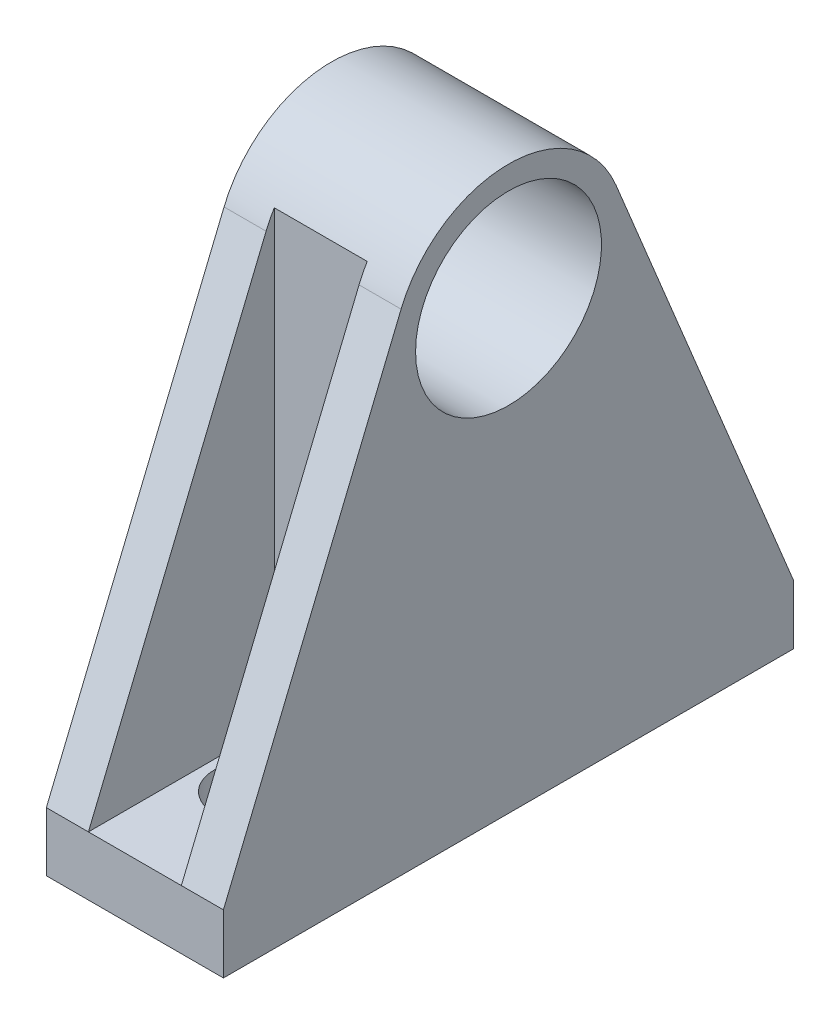
ISO-10303-21;
HEADER;
FILE_DESCRIPTION(('STEP AP214'),'2;1');
FILE_NAME('part.step','',(''),(''),'','','');
FILE_SCHEMA(('AUTOMOTIVE_DESIGN { 1 0 10303 214 1 1 1 1 }'));
ENDSEC;
DATA;
#1=APPLICATION_CONTEXT('core data for automotive mechanical design processes');
#2=APPLICATION_PROTOCOL_DEFINITION('international standard','automotive_design',2000,#1);
#3=PRODUCT_CONTEXT('',#1,'mechanical');
#4=PRODUCT('Part','Part','',(#3));
#5=PRODUCT_RELATED_PRODUCT_CATEGORY('part','',(#4));
#6=PRODUCT_DEFINITION_FORMATION('','',#4);
#7=PRODUCT_DEFINITION_CONTEXT('part definition',#1,'design');
#8=PRODUCT_DEFINITION('design','',#6,#7);
#9=PRODUCT_DEFINITION_SHAPE('','',#8);
#10=(LENGTH_UNIT() NAMED_UNIT(*) SI_UNIT(.MILLI.,.METRE.));
#11=(NAMED_UNIT(*) PLANE_ANGLE_UNIT() SI_UNIT($,.RADIAN.));
#12=(NAMED_UNIT(*) SI_UNIT($,.STERADIAN.) SOLID_ANGLE_UNIT());
#13=UNCERTAINTY_MEASURE_WITH_UNIT(LENGTH_MEASURE(1.E-05),#10,'distance_accuracy_value','');
#14=(GEOMETRIC_REPRESENTATION_CONTEXT(3) GLOBAL_UNCERTAINTY_ASSIGNED_CONTEXT((#13)) GLOBAL_UNIT_ASSIGNED_CONTEXT((#10,
#11,#12)) REPRESENTATION_CONTEXT('',''));
#15=CARTESIAN_POINT('',(0.,0.,0.));
#16=DIRECTION('',(0.,0.,1.));
#17=DIRECTION('',(1.,0.,0.));
#18=AXIS2_PLACEMENT_3D('',#15,#16,#17);
#19=CARTESIAN_POINT('',(19.05,6.35,-30.675));
#20=DIRECTION('',(0.,-0.380865334381038,0.924630519216633));
#21=DIRECTION('',(0.,-0.924630519216633,-0.380865334381038));
#22=AXIS2_PLACEMENT_3D('',#19,#20,#21);
#23=PLANE('',#22);
#24=DIRECTION('',(0.,0.924630519216633,0.380865334381038));
#25=VECTOR('',#24,1.);
#26=CARTESIAN_POINT('',(4.525,54.9041967592978,-10.675));
#27=LINE('',#26,#25);
#28=CARTESIAN_POINT('',(4.525,6.35000000000003,-30.675));
#29=VERTEX_POINT('',#28);
#30=CARTESIAN_POINT('',(4.525,52.760816679763,-11.5578814902079));
#31=VERTEX_POINT('',#30);
#32=EDGE_CURVE('E188',#29,#31,#27,.T.);
#33=ORIENTED_EDGE('',*,*,#32,.F.);
#34=DIRECTION('',(-1.,0.,0.));
#35=VECTOR('',#34,1.);
#36=CARTESIAN_POINT('',(19.05,6.35,-30.675));
#37=LINE('',#36,#35);
#38=CARTESIAN_POINT('',(0.,6.35,-30.675));
#39=VERTEX_POINT('',#38);
#40=EDGE_CURVE('E295',#29,#39,#37,.T.);
#41=ORIENTED_EDGE('',*,*,#40,.T.);
#42=DIRECTION('',(0.,0.924630519216633,0.380865334381038));
#43=VECTOR('',#42,1.);
#44=CARTESIAN_POINT('',(0.,6.35,-30.675));
#45=LINE('',#44,#43);
#46=CARTESIAN_POINT('',(0.,52.760816679763,-11.5578814902079));
#47=VERTEX_POINT('',#46);
#48=EDGE_CURVE('E263',#39,#47,#45,.T.);
#49=ORIENTED_EDGE('',*,*,#48,.T.);
#50=DIRECTION('',(-1.,0.,0.));
#51=VECTOR('',#50,1.);
#52=CARTESIAN_POINT('',(19.05,52.760816679763,-11.5578814902079));
#53=LINE('',#52,#51);
#54=EDGE_CURVE('E290',#31,#47,#53,.T.);
#55=ORIENTED_EDGE('',*,*,#54,.F.);
#56=EDGE_LOOP('',(#33,#41,#49,#55));
#57=FACE_BOUND('',#56,.T.);
#58=ADVANCED_FACE('F45',(#57),#23,.F.);
#59=CARTESIAN_POINT('',(19.05,48.,0.));
#60=DIRECTION('',(-1.,0.,0.));
#61=DIRECTION('',(0.,0.,1.));
#62=AXIS2_PLACEMENT_3D('',#59,#60,#61);
#63=CYLINDRICAL_SURFACE('',#62,12.5);
#64=DIRECTION('',(-1.,0.,0.));
#65=VECTOR('',#64,1.);
#66=CARTESIAN_POINT('',(19.05,52.760816679763,11.5578814902079));
#67=LINE('',#66,#65);
#68=CARTESIAN_POINT('',(4.525,52.760816679763,11.5578814902079));
#69=VERTEX_POINT('',#68);
#70=CARTESIAN_POINT('',(0.,52.760816679763,11.5578814902079));
#71=VERTEX_POINT('',#70);
#72=EDGE_CURVE('E285',#69,#71,#67,.T.);
#73=ORIENTED_EDGE('',*,*,#72,.F.);
#74=CARTESIAN_POINT('',(4.525,48.,0.));
#75=DIRECTION('',(-1.,0.,0.));
#76=DIRECTION('',(0.,0.,1.));
#77=AXIS2_PLACEMENT_3D('',#74,#75,#76);
#78=CIRCLE('',#77,12.5);
#79=CARTESIAN_POINT('',(4.525,54.5034125657227,10.675));
#80=VERTEX_POINT('',#79);
#81=EDGE_CURVE('E214',#69,#80,#78,.T.);
#82=ORIENTED_EDGE('',*,*,#81,.T.);
#83=DIRECTION('',(-1.,0.,0.));
#84=VECTOR('',#83,1.);
#85=CARTESIAN_POINT('',(19.05,54.5034125657227,10.675));
#86=LINE('',#85,#84);
#87=CARTESIAN_POINT('',(14.525,54.5034125657227,10.675));
#88=VERTEX_POINT('',#87);
#89=EDGE_CURVE('E11',#80,#88,#86,.F.);
#90=ORIENTED_EDGE('',*,*,#89,.T.);
#91=CARTESIAN_POINT('',(14.525,48.,0.));
#92=DIRECTION('',(-1.,0.,0.));
#93=DIRECTION('',(0.,0.,1.));
#94=AXIS2_PLACEMENT_3D('',#91,#92,#93);
#95=CIRCLE('',#94,12.5);
#96=CARTESIAN_POINT('',(14.525,52.760816679763,11.5578814902079));
#97=VERTEX_POINT('',#96);
#98=EDGE_CURVE('E211',#97,#88,#95,.T.);
#99=ORIENTED_EDGE('',*,*,#98,.F.);
#100=CARTESIAN_POINT('',(19.05,52.760816679763,11.5578814902079));
#101=VERTEX_POINT('',#100);
#102=EDGE_CURVE('E286',#101,#97,#67,.T.);
#103=ORIENTED_EDGE('',*,*,#102,.F.);
#104=CARTESIAN_POINT('',(19.05,48.,0.));
#105=DIRECTION('',(1.,0.,0.));
#106=DIRECTION('',(0.,0.,-1.));
#107=AXIS2_PLACEMENT_3D('',#104,#105,#106);
#108=CIRCLE('',#107,12.5);
#109=CARTESIAN_POINT('',(19.05,52.760816679763,-11.5578814902079));
#110=VERTEX_POINT('',#109);
#111=EDGE_CURVE('E246',#110,#101,#108,.T.);
#112=ORIENTED_EDGE('',*,*,#111,.F.);
#113=CARTESIAN_POINT('',(14.525,52.760816679763,-11.5578814902079));
#114=VERTEX_POINT('',#113);
#115=EDGE_CURVE('E291',#110,#114,#53,.T.);
#116=ORIENTED_EDGE('',*,*,#115,.T.);
#117=CARTESIAN_POINT('',(14.525,48.,0.));
#118=DIRECTION('',(1.,0.,0.));
#119=DIRECTION('',(0.,0.,-1.));
#120=AXIS2_PLACEMENT_3D('',#117,#118,#119);
#121=CIRCLE('',#120,12.5);
#122=CARTESIAN_POINT('',(14.525,54.5034125657227,-10.675));
#123=VERTEX_POINT('',#122);
#124=EDGE_CURVE('E304',#114,#123,#121,.T.);
#125=ORIENTED_EDGE('',*,*,#124,.T.);
#126=DIRECTION('',(-1.,0.,0.));
#127=VECTOR('',#126,1.);
#128=CARTESIAN_POINT('',(19.05,54.5034125657227,-10.675));
#129=LINE('',#128,#127);
#130=CARTESIAN_POINT('',(4.525,54.5034125657227,-10.675));
#131=VERTEX_POINT('',#130);
#132=EDGE_CURVE('E314',#123,#131,#129,.T.);
#133=ORIENTED_EDGE('',*,*,#132,.T.);
#134=CARTESIAN_POINT('',(4.525,48.,0.));
#135=DIRECTION('',(1.,0.,0.));
#136=DIRECTION('',(0.,0.,-1.));
#137=AXIS2_PLACEMENT_3D('',#134,#135,#136);
#138=CIRCLE('',#137,12.5);
#139=EDGE_CURVE('E54',#31,#131,#138,.T.);
#140=ORIENTED_EDGE('',*,*,#139,.F.);
#141=ORIENTED_EDGE('',*,*,#54,.T.);
#142=CARTESIAN_POINT('',(0.,48.,0.));
#143=DIRECTION('',(1.,0.,0.));
#144=DIRECTION('',(0.,0.,-1.));
#145=AXIS2_PLACEMENT_3D('',#142,#143,#144);
#146=CIRCLE('',#145,12.5);
#147=EDGE_CURVE('E267',#47,#71,#146,.T.);
#148=ORIENTED_EDGE('',*,*,#147,.T.);
#149=EDGE_LOOP('',(#73,#82,#90,#99,#103,#112,#116,#125,#133,#140,#141,#148));
#150=FACE_BOUND('',#149,.T.);
#151=ADVANCED_FACE('F330',(#150),#63,.T.);
#152=CARTESIAN_POINT('',(19.05,6.35,30.675));
#153=DIRECTION('',(0.,-0.380865334381038,-0.924630519216633));
#154=DIRECTION('',(0.,0.924630519216633,-0.380865334381038));
#155=AXIS2_PLACEMENT_3D('',#152,#153,#154);
#156=PLANE('',#155);
#157=DIRECTION('',(0.,-0.924630519216633,0.380865334381038));
#158=VECTOR('',#157,1.);
#159=CARTESIAN_POINT('',(14.525,54.9041967592978,10.675));
#160=LINE('',#159,#158);
#161=CARTESIAN_POINT('',(14.525,6.35,30.675));
#162=VERTEX_POINT('',#161);
#163=EDGE_CURVE('E175',#97,#162,#160,.T.);
#164=ORIENTED_EDGE('',*,*,#163,.T.);
#165=DIRECTION('',(-1.,0.,0.));
#166=VECTOR('',#165,1.);
#167=CARTESIAN_POINT('',(19.05,6.35,30.675));
#168=LINE('',#167,#166);
#169=CARTESIAN_POINT('',(19.05,6.35,30.675));
#170=VERTEX_POINT('',#169);
#171=EDGE_CURVE('E281',#170,#162,#168,.T.);
#172=ORIENTED_EDGE('',*,*,#171,.F.);
#173=DIRECTION('',(0.,-0.924630519216633,0.380865334381038));
#174=VECTOR('',#173,1.);
#175=CARTESIAN_POINT('',(19.05,6.35,30.675));
#176=LINE('',#175,#174);
#177=EDGE_CURVE('E249',#101,#170,#176,.T.);
#178=ORIENTED_EDGE('',*,*,#177,.F.);
#179=ORIENTED_EDGE('',*,*,#102,.T.);
#180=EDGE_LOOP('',(#164,#172,#178,#179));
#181=FACE_BOUND('',#180,.T.);
#182=ADVANCED_FACE('F375',(#181),#156,.F.);
#183=CARTESIAN_POINT('',(19.05,48.,0.));
#184=DIRECTION('',(1.,0.,0.));
#185=DIRECTION('',(0.,0.,-1.));
#186=AXIS2_PLACEMENT_3D('',#183,#184,#185);
#187=PLANE('',#186);
#188=DIRECTION('',(0.,0.,-1.));
#189=VECTOR('',#188,1.);
#190=CARTESIAN_POINT('',(19.05,0.,30.675));
#191=LINE('',#190,#189);
#192=CARTESIAN_POINT('',(19.05,0.,30.675));
#193=VERTEX_POINT('',#192);
#194=CARTESIAN_POINT('',(19.05,0.,-30.675));
#195=VERTEX_POINT('',#194);
#196=EDGE_CURVE('E235',#193,#195,#191,.T.);
#197=ORIENTED_EDGE('',*,*,#196,.T.);
#198=DIRECTION('',(0.,1.,0.));
#199=VECTOR('',#198,1.);
#200=CARTESIAN_POINT('',(19.05,0.,-30.675));
#201=LINE('',#200,#199);
#202=CARTESIAN_POINT('',(19.05,6.35,-30.675));
#203=VERTEX_POINT('',#202);
#204=EDGE_CURVE('E239',#195,#203,#201,.T.);
#205=ORIENTED_EDGE('',*,*,#204,.T.);
#206=DIRECTION('',(0.,0.924630519216633,0.380865334381038));
#207=VECTOR('',#206,1.);
#208=CARTESIAN_POINT('',(19.05,6.35,-30.675));
#209=LINE('',#208,#207);
#210=EDGE_CURVE('E243',#203,#110,#209,.T.);
#211=ORIENTED_EDGE('',*,*,#210,.T.);
#212=ORIENTED_EDGE('',*,*,#111,.T.);
#213=ORIENTED_EDGE('',*,*,#177,.T.);
#214=DIRECTION('',(0.,-1.,0.));
#215=VECTOR('',#214,1.);
#216=CARTESIAN_POINT('',(19.05,0.,30.675));
#217=LINE('',#216,#215);
#218=EDGE_CURVE('E252',#170,#193,#217,.T.);
#219=ORIENTED_EDGE('',*,*,#218,.T.);
#220=EDGE_LOOP('',(#197,#205,#211,#212,#213,#219));
#221=FACE_BOUND('',#220,.T.);
#222=CARTESIAN_POINT('',(19.05,48.,0.));
#223=DIRECTION('',(1.,0.,0.));
#224=DIRECTION('',(0.,0.,-1.));
#225=AXIS2_PLACEMENT_3D('',#222,#223,#224);
#226=CIRCLE('',#225,10.);
#227=CARTESIAN_POINT('',(19.05,48.,10.));
#228=VERTEX_POINT('',#227);
#229=EDGE_CURVE('E227',#228,#228,#226,.T.);
#230=ORIENTED_EDGE('',*,*,#229,.F.);
#231=EDGE_LOOP('',(#230));
#232=FACE_BOUND('',#231,.T.);
#233=ADVANCED_FACE('F370',(#221,#232),#187,.T.);
#234=CARTESIAN_POINT('',(0.,48.,0.));
#235=DIRECTION('',(1.,0.,0.));
#236=DIRECTION('',(0.,0.,-1.));
#237=AXIS2_PLACEMENT_3D('',#234,#235,#236);
#238=PLANE('',#237);
#239=DIRECTION('',(0.,0.,-1.));
#240=VECTOR('',#239,1.);
#241=CARTESIAN_POINT('',(0.,0.,30.675));
#242=LINE('',#241,#240);
#243=CARTESIAN_POINT('',(0.,0.,30.675));
#244=VERTEX_POINT('',#243);
#245=CARTESIAN_POINT('',(0.,0.,-30.675));
#246=VERTEX_POINT('',#245);
#247=EDGE_CURVE('E231',#244,#246,#242,.T.);
#248=ORIENTED_EDGE('',*,*,#247,.F.);
#249=DIRECTION('',(0.,-1.,0.));
#250=VECTOR('',#249,1.);
#251=CARTESIAN_POINT('',(0.,0.,30.675));
#252=LINE('',#251,#250);
#253=CARTESIAN_POINT('',(0.,6.35,30.675));
#254=VERTEX_POINT('',#253);
#255=EDGE_CURVE('E240',#254,#244,#252,.T.);
#256=ORIENTED_EDGE('',*,*,#255,.F.);
#257=DIRECTION('',(0.,-0.924630519216633,0.380865334381038));
#258=VECTOR('',#257,1.);
#259=CARTESIAN_POINT('',(0.,6.35,30.675));
#260=LINE('',#259,#258);
#261=EDGE_CURVE('E271',#71,#254,#260,.T.);
#262=ORIENTED_EDGE('',*,*,#261,.F.);
#263=ORIENTED_EDGE('',*,*,#147,.F.);
#264=ORIENTED_EDGE('',*,*,#48,.F.);
#265=DIRECTION('',(0.,1.,0.));
#266=VECTOR('',#265,1.);
#267=CARTESIAN_POINT('',(0.,0.,-30.675));
#268=LINE('',#267,#266);
#269=EDGE_CURVE('E259',#246,#39,#268,.T.);
#270=ORIENTED_EDGE('',*,*,#269,.F.);
#271=EDGE_LOOP('',(#248,#256,#262,#263,#264,#270));
#272=FACE_BOUND('',#271,.T.);
#273=CARTESIAN_POINT('',(0.,48.,0.));
#274=DIRECTION('',(1.,0.,0.));
#275=DIRECTION('',(0.,0.,-1.));
#276=AXIS2_PLACEMENT_3D('',#273,#274,#275);
#277=CIRCLE('',#276,10.);
#278=CARTESIAN_POINT('',(0.,48.,10.));
#279=VERTEX_POINT('',#278);
#280=EDGE_CURVE('E226',#279,#279,#277,.T.);
#281=ORIENTED_EDGE('',*,*,#280,.T.);
#282=EDGE_LOOP('',(#281));
#283=FACE_BOUND('',#282,.T.);
#284=ADVANCED_FACE('F362',(#272,#283),#238,.F.);
#285=CARTESIAN_POINT('',(19.05,0.,30.675));
#286=DIRECTION('',(0.,1.,0.));
#287=DIRECTION('',(0.,0.,1.));
#288=AXIS2_PLACEMENT_3D('',#285,#286,#287);
#289=PLANE('',#288);
#290=CARTESIAN_POINT('',(9.525,0.,18.175));
#291=DIRECTION('',(0.,1.,0.));
#292=DIRECTION('',(0.,0.,1.));
#293=AXIS2_PLACEMENT_3D('',#290,#291,#292);
#294=CIRCLE('',#293,4.);
#295=CARTESIAN_POINT('',(9.525,0.,22.175));
#296=VERTEX_POINT('',#295);
#297=EDGE_CURVE('E218',#296,#296,#294,.T.);
#298=ORIENTED_EDGE('',*,*,#297,.T.);
#299=EDGE_LOOP('',(#298));
#300=FACE_BOUND('',#299,.T.);
#301=CARTESIAN_POINT('',(9.525,0.,-18.175));
#302=DIRECTION('',(0.,1.,0.));
#303=DIRECTION('',(0.,0.,1.));
#304=AXIS2_PLACEMENT_3D('',#301,#302,#303);
#305=CIRCLE('',#304,4.);
#306=CARTESIAN_POINT('',(9.525,0.,-14.175));
#307=VERTEX_POINT('',#306);
#308=EDGE_CURVE('E222',#307,#307,#305,.T.);
#309=ORIENTED_EDGE('',*,*,#308,.T.);
#310=EDGE_LOOP('',(#309));
#311=FACE_BOUND('',#310,.T.);
#312=ORIENTED_EDGE('',*,*,#247,.T.);
#313=DIRECTION('',(-1.,0.,0.));
#314=VECTOR('',#313,1.);
#315=CARTESIAN_POINT('',(19.05,0.,-30.675));
#316=LINE('',#315,#314);
#317=EDGE_CURVE('E300',#195,#246,#316,.T.);
#318=ORIENTED_EDGE('',*,*,#317,.F.);
#319=ORIENTED_EDGE('',*,*,#196,.F.);
#320=DIRECTION('',(-1.,0.,0.));
#321=VECTOR('',#320,1.);
#322=CARTESIAN_POINT('',(19.05,0.,30.675));
#323=LINE('',#322,#321);
#324=EDGE_CURVE('E255',#193,#244,#323,.T.);
#325=ORIENTED_EDGE('',*,*,#324,.T.);
#326=EDGE_LOOP('',(#312,#318,#319,#325));
#327=FACE_BOUND('',#326,.T.);
#328=ADVANCED_FACE('F47',(#300,#311,#327),#289,.F.);
#329=CARTESIAN_POINT('',(19.05,0.,-30.675));
#330=DIRECTION('',(0.,0.,1.));
#331=DIRECTION('',(1.,0.,0.));
#332=AXIS2_PLACEMENT_3D('',#329,#330,#331);
#333=PLANE('',#332);
#334=ORIENTED_EDGE('',*,*,#269,.T.);
#335=ORIENTED_EDGE('',*,*,#40,.F.);
#336=DIRECTION('',(1.,0.,0.));
#337=VECTOR('',#336,1.);
#338=CARTESIAN_POINT('',(4.525,6.35000000000003,-30.675));
#339=LINE('',#338,#337);
#340=CARTESIAN_POINT('',(14.525,6.35000000000003,-30.675));
#341=VERTEX_POINT('',#340);
#342=EDGE_CURVE('E189',#29,#341,#339,.T.);
#343=ORIENTED_EDGE('',*,*,#342,.T.);
#344=EDGE_CURVE('E296',#203,#341,#37,.T.);
#345=ORIENTED_EDGE('',*,*,#344,.F.);
#346=ORIENTED_EDGE('',*,*,#204,.F.);
#347=ORIENTED_EDGE('',*,*,#317,.T.);
#348=EDGE_LOOP('',(#334,#335,#343,#345,#346,#347));
#349=FACE_BOUND('',#348,.T.);
#350=ADVANCED_FACE('F340',(#349),#333,.F.);
#351=ORIENTED_EDGE('',*,*,#344,.T.);
#352=DIRECTION('',(0.,0.924630519216633,0.380865334381038));
#353=VECTOR('',#352,1.);
#354=CARTESIAN_POINT('',(14.525,54.9041967592978,-10.675));
#355=LINE('',#354,#353);
#356=EDGE_CURVE('E193',#341,#114,#355,.T.);
#357=ORIENTED_EDGE('',*,*,#356,.T.);
#358=ORIENTED_EDGE('',*,*,#115,.F.);
#359=ORIENTED_EDGE('',*,*,#210,.F.);
#360=EDGE_LOOP('',(#351,#357,#358,#359));
#361=FACE_BOUND('',#360,.T.);
#362=ADVANCED_FACE('F336',(#361),#23,.F.);
#363=CARTESIAN_POINT('',(4.525,6.35,30.675));
#364=VERTEX_POINT('',#363);
#365=EDGE_CURVE('E280',#364,#254,#168,.T.);
#366=ORIENTED_EDGE('',*,*,#365,.F.);
#367=DIRECTION('',(0.,-0.924630519216633,0.380865334381038));
#368=VECTOR('',#367,1.);
#369=CARTESIAN_POINT('',(4.525,54.9041967592978,10.675));
#370=LINE('',#369,#368);
#371=EDGE_CURVE('E164',#69,#364,#370,.T.);
#372=ORIENTED_EDGE('',*,*,#371,.F.);
#373=ORIENTED_EDGE('',*,*,#72,.T.);
#374=ORIENTED_EDGE('',*,*,#261,.T.);
#375=EDGE_LOOP('',(#366,#372,#373,#374));
#376=FACE_BOUND('',#375,.T.);
#377=ADVANCED_FACE('F359',(#376),#156,.F.);
#378=CARTESIAN_POINT('',(19.05,0.,30.675));
#379=DIRECTION('',(0.,0.,-1.));
#380=DIRECTION('',(-1.,0.,0.));
#381=AXIS2_PLACEMENT_3D('',#378,#379,#380);
#382=PLANE('',#381);
#383=ORIENTED_EDGE('',*,*,#255,.T.);
#384=ORIENTED_EDGE('',*,*,#324,.F.);
#385=ORIENTED_EDGE('',*,*,#218,.F.);
#386=ORIENTED_EDGE('',*,*,#171,.T.);
#387=DIRECTION('',(1.,0.,0.));
#388=VECTOR('',#387,1.);
#389=CARTESIAN_POINT('',(4.525,6.35,30.675));
#390=LINE('',#389,#388);
#391=EDGE_CURVE('E156',#364,#162,#390,.T.);
#392=ORIENTED_EDGE('',*,*,#391,.F.);
#393=ORIENTED_EDGE('',*,*,#365,.T.);
#394=EDGE_LOOP('',(#383,#384,#385,#386,#392,#393));
#395=FACE_BOUND('',#394,.T.);
#396=ADVANCED_FACE('F354',(#395),#382,.F.);
#397=CARTESIAN_POINT('',(19.05,48.,0.));
#398=DIRECTION('',(-1.,0.,0.));
#399=DIRECTION('',(0.,0.,1.));
#400=AXIS2_PLACEMENT_3D('',#397,#398,#399);
#401=CYLINDRICAL_SURFACE('',#400,10.);
#402=CARTESIAN_POINT('',(19.05,48.,10.));
#403=CARTESIAN_POINT('',(18.8515625,48.,10.));
#404=CARTESIAN_POINT('',(18.653125,48.,10.));
#405=CARTESIAN_POINT('',(18.25625,48.,10.));
#406=CARTESIAN_POINT('',(18.0578125,48.,10.));
#407=CARTESIAN_POINT('',(17.6609375,48.,10.));
#408=CARTESIAN_POINT('',(17.4625,48.,10.));
#409=CARTESIAN_POINT('',(17.065625,48.,10.));
#410=CARTESIAN_POINT('',(16.8671875,48.,10.));
#411=CARTESIAN_POINT('',(16.4703125,48.,10.));
#412=CARTESIAN_POINT('',(16.271875,48.,10.));
#413=CARTESIAN_POINT('',(15.875,48.,10.));
#414=CARTESIAN_POINT('',(15.6765625,48.,10.));
#415=CARTESIAN_POINT('',(15.2796875,48.,10.));
#416=CARTESIAN_POINT('',(15.08125,48.,10.));
#417=CARTESIAN_POINT('',(14.684375,48.,10.));
#418=CARTESIAN_POINT('',(14.4859375,48.,10.));
#419=CARTESIAN_POINT('',(14.0890625,48.,10.));
#420=CARTESIAN_POINT('',(13.890625,48.,10.));
#421=CARTESIAN_POINT('',(13.49375,48.,10.));
#422=CARTESIAN_POINT('',(13.2953125,48.,10.));
#423=CARTESIAN_POINT('',(12.8984375,48.,10.));
#424=CARTESIAN_POINT('',(12.7,48.,10.));
#425=CARTESIAN_POINT('',(12.303125,48.,10.));
#426=CARTESIAN_POINT('',(12.1046875,48.,10.));
#427=CARTESIAN_POINT('',(11.7078125,48.,10.));
#428=CARTESIAN_POINT('',(11.509375,48.,10.));
#429=CARTESIAN_POINT('',(11.1125,48.,10.));
#430=CARTESIAN_POINT('',(10.9140625,48.,10.));
#431=CARTESIAN_POINT('',(10.5171875,48.,10.));
#432=CARTESIAN_POINT('',(10.31875,48.,10.));
#433=CARTESIAN_POINT('',(9.921875,48.,10.));
#434=CARTESIAN_POINT('',(9.7234375,48.,10.));
#435=CARTESIAN_POINT('',(9.3265625,48.,10.));
#436=CARTESIAN_POINT('',(9.128125,48.,10.));
#437=CARTESIAN_POINT('',(8.73125,48.,10.));
#438=CARTESIAN_POINT('',(8.5328125,48.,10.));
#439=CARTESIAN_POINT('',(8.1359375,48.,10.));
#440=CARTESIAN_POINT('',(7.9375,48.,10.));
#441=CARTESIAN_POINT('',(7.540625,48.,10.));
#442=CARTESIAN_POINT('',(7.3421875,48.,10.));
#443=CARTESIAN_POINT('',(6.9453125,48.,10.));
#444=CARTESIAN_POINT('',(6.746875,48.,10.));
#445=CARTESIAN_POINT('',(6.35,48.,10.));
#446=CARTESIAN_POINT('',(6.1515625,48.,10.));
#447=CARTESIAN_POINT('',(5.7546875,48.,10.));
#448=CARTESIAN_POINT('',(5.55625,48.,10.));
#449=CARTESIAN_POINT('',(5.159375,48.,10.));
#450=CARTESIAN_POINT('',(4.9609375,48.,10.));
#451=CARTESIAN_POINT('',(4.5640625,48.,10.));
#452=CARTESIAN_POINT('',(4.365625,48.,10.));
#453=CARTESIAN_POINT('',(3.96875,48.,10.));
#454=CARTESIAN_POINT('',(3.7703125,48.,10.));
#455=CARTESIAN_POINT('',(3.3734375,48.,10.));
#456=CARTESIAN_POINT('',(3.175,48.,10.));
#457=CARTESIAN_POINT('',(2.778125,48.,10.));
#458=CARTESIAN_POINT('',(2.5796875,48.,10.));
#459=CARTESIAN_POINT('',(2.1828125,48.,10.));
#460=CARTESIAN_POINT('',(1.984375,48.,10.));
#461=CARTESIAN_POINT('',(1.5875,48.,10.));
#462=CARTESIAN_POINT('',(1.3890625,48.,10.));
#463=CARTESIAN_POINT('',(0.992187500000001,48.,10.));
#464=CARTESIAN_POINT('',(0.793750000000001,48.,10.));
#465=CARTESIAN_POINT('',(0.396875,48.,10.));
#466=CARTESIAN_POINT('',(0.1984375,48.,10.));
#467=CARTESIAN_POINT('',(0.,48.,10.));
#468=B_SPLINE_CURVE_WITH_KNOTS('',3,(#402,#403,#404,#405,#406,#407,#408,#409,#410,#411,#412,
#413,#414,#415,#416,#417,#418,#419,#420,#421,#422,#423,#424,#425,#426,#427,#428,#429,#430,#431,
#432,#433,#434,#435,#436,#437,#438,#439,#440,#441,#442,#443,#444,#445,#446,#447,#448,#449,#450,
#451,#452,#453,#454,#455,#456,#457,#458,#459,#460,#461,#462,#463,#464,#465,#466,#467),
.UNSPECIFIED.,.F.,.F.,(4,2,2,2,2,2,2,2,2,2,2,2,2,2,2,2,2,2,2,2,2,2,2,2,2,2,2,2,2,2,2,2,4),(0.,
0.5953125,1.190625,1.7859375,2.38125,2.9765625,3.571875,4.1671875,4.7625,5.3578125,5.953125,
6.5484375,7.14375,7.7390625,8.334375,8.9296875,9.525,10.1203125,10.715625,11.3109375,11.90625,
12.5015625,13.096875,13.6921875,14.2875,14.8828125,15.478125,16.0734375,16.66875,17.2640625,
17.859375,18.4546875,19.05),.UNSPECIFIED.);
#469=EDGE_CURVE('BSEAM425',#228,#279,#468,.T.);
#470=ORIENTED_EDGE('',*,*,#229,.T.);
#471=ORIENTED_EDGE('',*,*,#280,.F.);
#472=ORIENTED_EDGE('',*,*,#469,.T.);
#473=ORIENTED_EDGE('',*,*,#469,.F.);
#474=EDGE_LOOP('',(#470,#472,#471,#473));
#475=FACE_BOUND('',#474,.T.);
#476=ADVANCED_FACE('F425',(#475),#401,.F.);
#477=CARTESIAN_POINT('',(9.525,-83.6360911799602,18.175));
#478=DIRECTION('',(0.,1.,0.));
#479=DIRECTION('',(0.,0.,1.));
#480=AXIS2_PLACEMENT_3D('',#477,#478,#479);
#481=CYLINDRICAL_SURFACE('',#480,4.);
#482=CARTESIAN_POINT('',(9.525,6.35000000000001,18.175));
#483=DIRECTION('',(0.,-1.,0.));
#484=DIRECTION('',(0.,0.,-1.));
#485=AXIS2_PLACEMENT_3D('',#482,#483,#484);
#486=CIRCLE('',#485,4.);
#487=CARTESIAN_POINT('',(9.525,6.35000000000001,14.175));
#488=VERTEX_POINT('',#487);
#489=EDGE_CURVE('E215',#488,#488,#486,.F.);
#490=ORIENTED_EDGE('',*,*,#489,.T.);
#491=EDGE_LOOP('',(#490));
#492=FACE_BOUND('',#491,.T.);
#493=ORIENTED_EDGE('',*,*,#297,.F.);
#494=EDGE_LOOP('',(#493));
#495=FACE_BOUND('',#494,.T.);
#496=ADVANCED_FACE('F417',(#492,#495),#481,.F.);
#497=CARTESIAN_POINT('',(9.525,-83.6360911799602,-18.175));
#498=DIRECTION('',(0.,1.,0.));
#499=DIRECTION('',(0.,0.,1.));
#500=AXIS2_PLACEMENT_3D('',#497,#498,#499);
#501=CYLINDRICAL_SURFACE('',#500,4.);
#502=CARTESIAN_POINT('',(9.525,6.35000000000004,-18.175));
#503=DIRECTION('',(0.,-1.,0.));
#504=DIRECTION('',(0.,0.,-1.));
#505=AXIS2_PLACEMENT_3D('',#502,#503,#504);
#506=CIRCLE('',#505,4.);
#507=CARTESIAN_POINT('',(9.525,6.35000000000004,-22.175));
#508=VERTEX_POINT('',#507);
#509=EDGE_CURVE('E155',#508,#508,#506,.F.);
#510=ORIENTED_EDGE('',*,*,#509,.T.);
#511=EDGE_LOOP('',(#510));
#512=FACE_BOUND('',#511,.T.);
#513=ORIENTED_EDGE('',*,*,#308,.F.);
#514=EDGE_LOOP('',(#513));
#515=FACE_BOUND('',#514,.T.);
#516=ADVANCED_FACE('F415',(#512,#515),#501,.F.);
#517=CARTESIAN_POINT('',(4.525,54.9041967592978,-10.675));
#518=DIRECTION('',(0.,0.,1.));
#519=DIRECTION('',(0.,-1.,0.));
#520=AXIS2_PLACEMENT_3D('',#517,#518,#519);
#521=PLANE('',#520);
#522=DIRECTION('',(0.,-1.,0.));
#523=VECTOR('',#522,1.);
#524=CARTESIAN_POINT('',(14.525,54.9041967592978,-10.675));
#525=LINE('',#524,#523);
#526=CARTESIAN_POINT('',(14.525,6.35000000000003,-10.675));
#527=VERTEX_POINT('',#526);
#528=EDGE_CURVE('E61',#123,#527,#525,.T.);
#529=ORIENTED_EDGE('',*,*,#528,.T.);
#530=DIRECTION('',(1.,0.,0.));
#531=VECTOR('',#530,1.);
#532=CARTESIAN_POINT('',(4.525,6.35000000000003,-10.675));
#533=LINE('',#532,#531);
#534=CARTESIAN_POINT('',(4.525,6.35000000000003,-10.675));
#535=VERTEX_POINT('',#534);
#536=EDGE_CURVE('E184',#535,#527,#533,.T.);
#537=ORIENTED_EDGE('',*,*,#536,.F.);
#538=DIRECTION('',(0.,-1.,0.));
#539=VECTOR('',#538,1.);
#540=CARTESIAN_POINT('',(4.525,54.9041967592978,-10.675));
#541=LINE('',#540,#539);
#542=EDGE_CURVE('E198',#131,#535,#541,.T.);
#543=ORIENTED_EDGE('',*,*,#542,.F.);
#544=ORIENTED_EDGE('',*,*,#132,.F.);
#545=EDGE_LOOP('',(#529,#537,#543,#544));
#546=FACE_BOUND('',#545,.T.);
#547=ADVANCED_FACE('F327',(#546),#521,.F.);
#548=CARTESIAN_POINT('',(4.525,0.,0.));
#549=DIRECTION('',(1.,0.,0.));
#550=DIRECTION('',(0.,0.,-1.));
#551=AXIS2_PLACEMENT_3D('',#548,#549,#550);
#552=PLANE('',#551);
#553=ORIENTED_EDGE('',*,*,#139,.T.);
#554=ORIENTED_EDGE('',*,*,#542,.T.);
#555=DIRECTION('',(0.,0.,-1.));
#556=VECTOR('',#555,1.);
#557=CARTESIAN_POINT('',(4.525,6.35000000000003,-10.675));
#558=LINE('',#557,#556);
#559=EDGE_CURVE('E205',#535,#29,#558,.T.);
#560=ORIENTED_EDGE('',*,*,#559,.T.);
#561=ORIENTED_EDGE('',*,*,#32,.T.);
#562=EDGE_LOOP('',(#553,#554,#560,#561));
#563=FACE_BOUND('',#562,.T.);
#564=ADVANCED_FACE('F321',(#563),#552,.T.);
#565=CARTESIAN_POINT('',(14.525,0.,0.));
#566=DIRECTION('',(1.,0.,0.));
#567=DIRECTION('',(0.,0.,-1.));
#568=AXIS2_PLACEMENT_3D('',#565,#566,#567);
#569=PLANE('',#568);
#570=ORIENTED_EDGE('',*,*,#356,.F.);
#571=DIRECTION('',(0.,0.,-1.));
#572=VECTOR('',#571,1.);
#573=CARTESIAN_POINT('',(14.525,6.35000000000003,-10.675));
#574=LINE('',#573,#572);
#575=EDGE_CURVE('E197',#527,#341,#574,.T.);
#576=ORIENTED_EDGE('',*,*,#575,.F.);
#577=ORIENTED_EDGE('',*,*,#528,.F.);
#578=ORIENTED_EDGE('',*,*,#124,.F.);
#579=EDGE_LOOP('',(#570,#576,#577,#578));
#580=FACE_BOUND('',#579,.T.);
#581=ADVANCED_FACE('F334',(#580),#569,.F.);
#582=CARTESIAN_POINT('',(4.525,6.35000000000003,-10.675));
#583=DIRECTION('',(0.,-1.,0.));
#584=DIRECTION('',(0.,0.,-1.));
#585=AXIS2_PLACEMENT_3D('',#582,#583,#584);
#586=PLANE('',#585);
#587=ORIENTED_EDGE('',*,*,#575,.T.);
#588=ORIENTED_EDGE('',*,*,#342,.F.);
#589=ORIENTED_EDGE('',*,*,#559,.F.);
#590=ORIENTED_EDGE('',*,*,#536,.T.);
#591=EDGE_LOOP('',(#587,#588,#589,#590));
#592=FACE_BOUND('',#591,.T.);
#593=ORIENTED_EDGE('',*,*,#509,.F.);
#594=EDGE_LOOP('',(#593));
#595=FACE_BOUND('',#594,.T.);
#596=ADVANCED_FACE('F343',(#592,#595),#586,.F.);
#597=CARTESIAN_POINT('',(4.525,54.9041967592978,10.675));
#598=DIRECTION('',(0.,0.,-1.));
#599=DIRECTION('',(0.,1.,0.));
#600=AXIS2_PLACEMENT_3D('',#597,#598,#599);
#601=PLANE('',#600);
#602=DIRECTION('',(0.,1.,0.));
#603=VECTOR('',#602,1.);
#604=CARTESIAN_POINT('',(4.525,54.9041967592978,10.675));
#605=LINE('',#604,#603);
#606=CARTESIAN_POINT('',(4.525,6.35,10.675));
#607=VERTEX_POINT('',#606);
#608=EDGE_CURVE('E161',#607,#80,#605,.T.);
#609=ORIENTED_EDGE('',*,*,#608,.F.);
#610=DIRECTION('',(1.,0.,0.));
#611=VECTOR('',#610,1.);
#612=CARTESIAN_POINT('',(4.525,6.35,10.675));
#613=LINE('',#612,#611);
#614=CARTESIAN_POINT('',(14.525,6.35,10.675));
#615=VERTEX_POINT('',#614);
#616=EDGE_CURVE('E145',#607,#615,#613,.T.);
#617=ORIENTED_EDGE('',*,*,#616,.T.);
#618=DIRECTION('',(0.,1.,0.));
#619=VECTOR('',#618,1.);
#620=CARTESIAN_POINT('',(14.525,54.9041967592978,10.675));
#621=LINE('',#620,#619);
#622=EDGE_CURVE('E181',#615,#88,#621,.T.);
#623=ORIENTED_EDGE('',*,*,#622,.T.);
#624=ORIENTED_EDGE('',*,*,#89,.F.);
#625=EDGE_LOOP('',(#609,#617,#623,#624));
#626=FACE_BOUND('',#625,.T.);
#627=ADVANCED_FACE('F168',(#626),#601,.F.);
#628=CARTESIAN_POINT('',(4.525,0.,0.));
#629=DIRECTION('',(-1.,0.,0.));
#630=DIRECTION('',(0.,0.,1.));
#631=AXIS2_PLACEMENT_3D('',#628,#629,#630);
#632=PLANE('',#631);
#633=ORIENTED_EDGE('',*,*,#371,.T.);
#634=DIRECTION('',(0.,0.,-1.));
#635=VECTOR('',#634,1.);
#636=CARTESIAN_POINT('',(4.525,6.35,10.675));
#637=LINE('',#636,#635);
#638=EDGE_CURVE('E69',#364,#607,#637,.T.);
#639=ORIENTED_EDGE('',*,*,#638,.T.);
#640=ORIENTED_EDGE('',*,*,#608,.T.);
#641=ORIENTED_EDGE('',*,*,#81,.F.);
#642=EDGE_LOOP('',(#633,#639,#640,#641));
#643=FACE_BOUND('',#642,.T.);
#644=ADVANCED_FACE('F160',(#643),#632,.F.);
#645=CARTESIAN_POINT('',(14.525,0.,0.));
#646=DIRECTION('',(-1.,0.,0.));
#647=DIRECTION('',(0.,0.,1.));
#648=AXIS2_PLACEMENT_3D('',#645,#646,#647);
#649=PLANE('',#648);
#650=ORIENTED_EDGE('',*,*,#98,.T.);
#651=ORIENTED_EDGE('',*,*,#622,.F.);
#652=DIRECTION('',(0.,0.,-1.));
#653=VECTOR('',#652,1.);
#654=CARTESIAN_POINT('',(14.525,6.35,10.675));
#655=LINE('',#654,#653);
#656=EDGE_CURVE('E149',#162,#615,#655,.T.);
#657=ORIENTED_EDGE('',*,*,#656,.F.);
#658=ORIENTED_EDGE('',*,*,#163,.F.);
#659=EDGE_LOOP('',(#650,#651,#657,#658));
#660=FACE_BOUND('',#659,.T.);
#661=ADVANCED_FACE('F378',(#660),#649,.T.);
#662=CARTESIAN_POINT('',(4.525,6.35,10.675));
#663=DIRECTION('',(0.,-1.,0.));
#664=DIRECTION('',(0.,0.,-1.));
#665=AXIS2_PLACEMENT_3D('',#662,#663,#664);
#666=PLANE('',#665);
#667=ORIENTED_EDGE('',*,*,#656,.T.);
#668=ORIENTED_EDGE('',*,*,#616,.F.);
#669=ORIENTED_EDGE('',*,*,#638,.F.);
#670=ORIENTED_EDGE('',*,*,#391,.T.);
#671=EDGE_LOOP('',(#667,#668,#669,#670));
#672=FACE_BOUND('',#671,.T.);
#673=ORIENTED_EDGE('',*,*,#489,.F.);
#674=EDGE_LOOP('',(#673));
#675=FACE_BOUND('',#674,.T.);
#676=ADVANCED_FACE('F146',(#672,#675),#666,.F.);
#677=CLOSED_SHELL('',(#58,#151,#182,#233,#284,#328,#350,#362,#377,#396,#476,#496,#516,#547,#564,
#581,#596,#627,#644,#661,#676));
#678=MANIFOLD_SOLID_BREP('B2',#677);
#679=ADVANCED_BREP_SHAPE_REPRESENTATION('',(#18,#678),#14);
#680=SHAPE_DEFINITION_REPRESENTATION(#9,#679);
ENDSEC;
END-ISO-10303-21;
